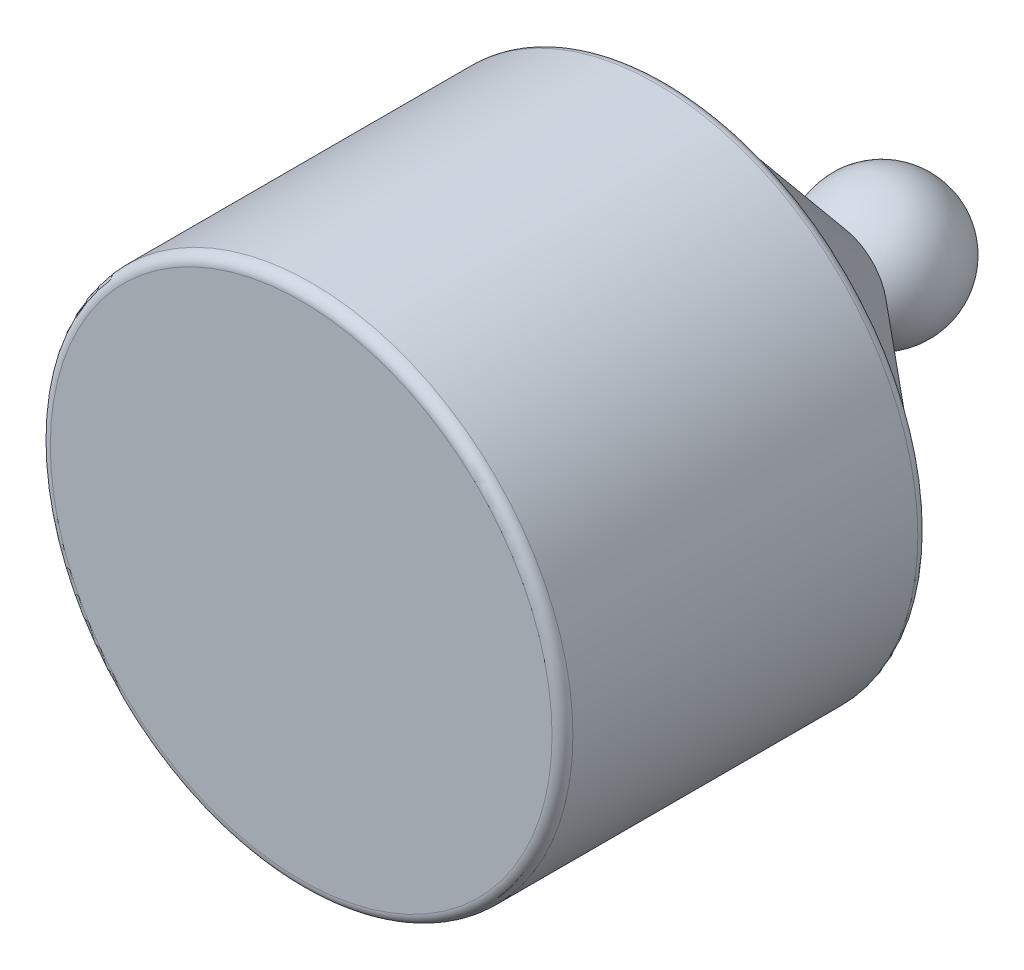
ISO-10303-21;
HEADER;
FILE_DESCRIPTION(('STEP AP214'),'2;1');
FILE_NAME('part.step','',(''),(''),'','','');
FILE_SCHEMA(('AUTOMOTIVE_DESIGN { 1 0 10303 214 1 1 1 1 }'));
ENDSEC;
DATA;
#1=APPLICATION_CONTEXT('core data for automotive mechanical design processes');
#2=APPLICATION_PROTOCOL_DEFINITION('international standard','automotive_design',2000,#1);
#3=PRODUCT_CONTEXT('',#1,'mechanical');
#4=PRODUCT('Part','Part','',(#3));
#5=PRODUCT_RELATED_PRODUCT_CATEGORY('part','',(#4));
#6=PRODUCT_DEFINITION_FORMATION('','',#4);
#7=PRODUCT_DEFINITION_CONTEXT('part definition',#1,'design');
#8=PRODUCT_DEFINITION('design','',#6,#7);
#9=PRODUCT_DEFINITION_SHAPE('','',#8);
#10=(LENGTH_UNIT() NAMED_UNIT(*) SI_UNIT(.MILLI.,.METRE.));
#11=(NAMED_UNIT(*) PLANE_ANGLE_UNIT() SI_UNIT($,.RADIAN.));
#12=(NAMED_UNIT(*) SI_UNIT($,.STERADIAN.) SOLID_ANGLE_UNIT());
#13=UNCERTAINTY_MEASURE_WITH_UNIT(LENGTH_MEASURE(1.E-05),#10,'distance_accuracy_value','');
#14=(GEOMETRIC_REPRESENTATION_CONTEXT(3) GLOBAL_UNCERTAINTY_ASSIGNED_CONTEXT((#13)) GLOBAL_UNIT_ASSIGNED_CONTEXT((#10,
#11,#12)) REPRESENTATION_CONTEXT('',''));
#15=CARTESIAN_POINT('',(0.,0.,0.));
#16=DIRECTION('',(0.,0.,1.));
#17=DIRECTION('',(1.,0.,0.));
#18=AXIS2_PLACEMENT_3D('',#15,#16,#17);
#19=CARTESIAN_POINT('',(0.,0.,7.));
#20=DIRECTION('',(0.,0.,-1.));
#21=DIRECTION('',(-1.,0.,0.));
#22=AXIS2_PLACEMENT_3D('',#19,#20,#21);
#23=CYLINDRICAL_SURFACE('',#22,5.);
#24=CARTESIAN_POINT('',(0.,0.,0.2));
#25=DIRECTION('',(0.,0.,1.));
#26=DIRECTION('',(1.,0.,0.));
#27=AXIS2_PLACEMENT_3D('',#24,#25,#26);
#28=CIRCLE('',#27,5.);
#29=CARTESIAN_POINT('',(-5.,0.,0.2));
#30=VERTEX_POINT('',#29);
#31=EDGE_CURVE('E44',#30,#30,#28,.T.);
#32=CARTESIAN_POINT('',(0.,0.,6.8));
#33=DIRECTION('',(0.,0.,1.));
#34=DIRECTION('',(1.,0.,0.));
#35=AXIS2_PLACEMENT_3D('',#32,#33,#34);
#36=CIRCLE('',#35,5.);
#37=CARTESIAN_POINT('',(-5.,0.,6.8));
#38=VERTEX_POINT('',#37);
#39=EDGE_CURVE('E59',#38,#38,#36,.F.);
#40=CARTESIAN_POINT('',(-5.,0.,0.2));
#41=CARTESIAN_POINT('',(-5.,0.,0.26875));
#42=CARTESIAN_POINT('',(-5.,0.,0.3375));
#43=CARTESIAN_POINT('',(-5.,0.,0.474999999999999));
#44=CARTESIAN_POINT('',(-5.,0.,0.543749999999999));
#45=CARTESIAN_POINT('',(-5.,0.,0.681249999999999));
#46=CARTESIAN_POINT('',(-5.,0.,0.749999999999999));
#47=CARTESIAN_POINT('',(-5.,0.,0.887499999999999));
#48=CARTESIAN_POINT('',(-5.,0.,0.95625));
#49=CARTESIAN_POINT('',(-5.,0.,1.09375));
#50=CARTESIAN_POINT('',(-5.,0.,1.1625));
#51=CARTESIAN_POINT('',(-5.,0.,1.3));
#52=CARTESIAN_POINT('',(-5.,0.,1.36875));
#53=CARTESIAN_POINT('',(-5.,0.,1.50625));
#54=CARTESIAN_POINT('',(-5.,0.,1.575));
#55=CARTESIAN_POINT('',(-5.,0.,1.7125));
#56=CARTESIAN_POINT('',(-5.,0.,1.78125));
#57=CARTESIAN_POINT('',(-5.,0.,1.91875));
#58=CARTESIAN_POINT('',(-5.,0.,1.9875));
#59=CARTESIAN_POINT('',(-5.,0.,2.125));
#60=CARTESIAN_POINT('',(-5.,0.,2.19375));
#61=CARTESIAN_POINT('',(-5.,0.,2.33125));
#62=CARTESIAN_POINT('',(-5.,0.,2.4));
#63=CARTESIAN_POINT('',(-5.,0.,2.5375));
#64=CARTESIAN_POINT('',(-5.,0.,2.60625));
#65=CARTESIAN_POINT('',(-5.,0.,2.74375));
#66=CARTESIAN_POINT('',(-5.,0.,2.8125));
#67=CARTESIAN_POINT('',(-5.,0.,2.95));
#68=CARTESIAN_POINT('',(-5.,0.,3.01875));
#69=CARTESIAN_POINT('',(-5.,0.,3.15625));
#70=CARTESIAN_POINT('',(-5.,0.,3.225));
#71=CARTESIAN_POINT('',(-5.,0.,3.3625));
#72=CARTESIAN_POINT('',(-5.,0.,3.43125));
#73=CARTESIAN_POINT('',(-5.,0.,3.56875));
#74=CARTESIAN_POINT('',(-5.,0.,3.6375));
#75=CARTESIAN_POINT('',(-5.,0.,3.775));
#76=CARTESIAN_POINT('',(-5.,0.,3.84375));
#77=CARTESIAN_POINT('',(-5.,0.,3.98125));
#78=CARTESIAN_POINT('',(-5.,0.,4.05));
#79=CARTESIAN_POINT('',(-5.,0.,4.1875));
#80=CARTESIAN_POINT('',(-5.,0.,4.25625));
#81=CARTESIAN_POINT('',(-5.,0.,4.39375));
#82=CARTESIAN_POINT('',(-5.,0.,4.4625));
#83=CARTESIAN_POINT('',(-5.,0.,4.6));
#84=CARTESIAN_POINT('',(-5.,0.,4.66875));
#85=CARTESIAN_POINT('',(-5.,0.,4.80625));
#86=CARTESIAN_POINT('',(-5.,0.,4.875));
#87=CARTESIAN_POINT('',(-5.,0.,5.0125));
#88=CARTESIAN_POINT('',(-5.,0.,5.08125));
#89=CARTESIAN_POINT('',(-5.,0.,5.21875));
#90=CARTESIAN_POINT('',(-5.,0.,5.2875));
#91=CARTESIAN_POINT('',(-5.,0.,5.425));
#92=CARTESIAN_POINT('',(-5.,0.,5.49375));
#93=CARTESIAN_POINT('',(-5.,0.,5.63125));
#94=CARTESIAN_POINT('',(-5.,0.,5.7));
#95=CARTESIAN_POINT('',(-5.,0.,5.8375));
#96=CARTESIAN_POINT('',(-5.,0.,5.90625));
#97=CARTESIAN_POINT('',(-5.,0.,6.04375));
#98=CARTESIAN_POINT('',(-5.,0.,6.1125));
#99=CARTESIAN_POINT('',(-5.,0.,6.25));
#100=CARTESIAN_POINT('',(-5.,0.,6.31875));
#101=CARTESIAN_POINT('',(-5.,0.,6.45625));
#102=CARTESIAN_POINT('',(-5.,0.,6.525));
#103=CARTESIAN_POINT('',(-5.,0.,6.6625));
#104=CARTESIAN_POINT('',(-5.,0.,6.73125));
#105=CARTESIAN_POINT('',(-5.,0.,6.8));
#106=B_SPLINE_CURVE_WITH_KNOTS('',3,(#40,#41,#42,#43,#44,#45,#46,#47,#48,#49,#50,#51,#52,#53,
#54,#55,#56,#57,#58,#59,#60,#61,#62,#63,#64,#65,#66,#67,#68,#69,#70,#71,#72,#73,#74,#75,#76,#77,
#78,#79,#80,#81,#82,#83,#84,#85,#86,#87,#88,#89,#90,#91,#92,#93,#94,#95,#96,#97,#98,#99,#100,
#101,#102,#103,#104,#105),.UNSPECIFIED.,.F.,.F.,(4,2,2,2,2,2,2,2,2,2,2,2,2,2,2,2,2,2,2,2,2,2,2,
2,2,2,2,2,2,2,2,2,4),(0.,0.20625,0.4125,0.618749999999999,0.825,1.03125,1.2375,1.44375,1.65,
1.85625,2.0625,2.26875,2.475,2.68125,2.8875,3.09375,3.3,3.50625,3.7125,3.91875,4.125,4.33125,
4.5375,4.74375,4.95,5.15625,5.3625,5.56875,5.775,5.98125,6.1875,6.39375,6.6),.UNSPECIFIED.);
#107=EDGE_CURVE('BSEAM37',#30,#38,#106,.T.);
#108=ORIENTED_EDGE('',*,*,#31,.T.);
#109=ORIENTED_EDGE('',*,*,#39,.T.);
#110=ORIENTED_EDGE('',*,*,#107,.T.);
#111=ORIENTED_EDGE('',*,*,#107,.F.);
#112=EDGE_LOOP('',(#108,#110,#109,#111));
#113=FACE_BOUND('',#112,.T.);
#114=ADVANCED_FACE('F37',(#113),#23,.T.);
#115=CARTESIAN_POINT('',(0.,0.,7.));
#116=DIRECTION('',(0.,0.,1.));
#117=DIRECTION('',(1.,0.,0.));
#118=AXIS2_PLACEMENT_3D('',#115,#116,#117);
#119=PLANE('',#118);
#120=CARTESIAN_POINT('',(0.,0.,7.));
#121=DIRECTION('',(0.,0.,1.));
#122=DIRECTION('',(1.,0.,0.));
#123=AXIS2_PLACEMENT_3D('',#120,#121,#122);
#124=CIRCLE('',#123,4.8);
#125=CARTESIAN_POINT('',(4.8,0.,7.));
#126=VERTEX_POINT('',#125);
#127=EDGE_CURVE('E56',#126,#126,#124,.T.);
#128=ORIENTED_EDGE('',*,*,#127,.T.);
#129=EDGE_LOOP('',(#128));
#130=FACE_BOUND('',#129,.T.);
#131=ADVANCED_FACE('F74',(#130),#119,.T.);
#132=CARTESIAN_POINT('',(0.,0.,6.8));
#133=DIRECTION('',(0.,0.,1.));
#134=DIRECTION('',(1.,0.,0.));
#135=AXIS2_PLACEMENT_3D('',#132,#133,#134);
#136=TOROIDAL_SURFACE('',#135,4.8,0.2);
#137=ORIENTED_EDGE('',*,*,#39,.F.);
#138=EDGE_LOOP('',(#137));
#139=FACE_BOUND('',#138,.T.);
#140=ORIENTED_EDGE('',*,*,#127,.F.);
#141=EDGE_LOOP('',(#140));
#142=FACE_BOUND('',#141,.T.);
#143=ADVANCED_FACE('F69',(#139,#142),#136,.T.);
#144=CARTESIAN_POINT('',(0.,0.,0.2));
#145=DIRECTION('',(0.,0.,1.));
#146=DIRECTION('',(1.,0.,0.));
#147=AXIS2_PLACEMENT_3D('',#144,#145,#146);
#148=TOROIDAL_SURFACE('',#147,4.8,0.2);
#149=CARTESIAN_POINT('',(0.,0.,0.));
#150=DIRECTION('',(0.,0.,1.));
#151=DIRECTION('',(1.,0.,0.));
#152=AXIS2_PLACEMENT_3D('',#149,#150,#151);
#153=CIRCLE('',#152,4.8);
#154=CARTESIAN_POINT('',(4.8,0.,0.));
#155=VERTEX_POINT('',#154);
#156=EDGE_CURVE('E11',#155,#155,#153,.F.);
#157=ORIENTED_EDGE('',*,*,#156,.F.);
#158=EDGE_LOOP('',(#157));
#159=FACE_BOUND('',#158,.T.);
#160=ORIENTED_EDGE('',*,*,#31,.F.);
#161=EDGE_LOOP('',(#160));
#162=FACE_BOUND('',#161,.T.);
#163=ADVANCED_FACE('F39',(#159,#162),#148,.T.);
#164=CARTESIAN_POINT('',(0.0178548398402125,0.,-4.09989551556878));
#165=DIRECTION('',(0.,-1.,0.));
#166=DIRECTION('',(-1.,0.,0.));
#167=AXIS2_PLACEMENT_3D('',#164,#165,#166);
#168=CIRCLE('',#167,1.32219384404725);
#169=TRIMMED_CURVE('',#168,(PARAMETER_VALUE(-1.55729196612696)),
(PARAMETER_VALUE(1.55729196612696)),.T.,.PARAMETER.);
#170=CARTESIAN_POINT('',(0.,0.,-4.09989551556878));
#171=DIRECTION('',(0.,0.,-1.));
#172=AXIS1_PLACEMENT('',#170,#171);
#173=SURFACE_OF_REVOLUTION('',#169,#172);
#174=CARTESIAN_POINT('',(0.,0.,-5.42196879868539));
#175=VERTEX_POINT('',#174);
#176=VERTEX_LOOP('',#175);
#177=FACE_BOUND('',#176,.T.);
#178=CARTESIAN_POINT('',(0.,0.,-3.23036151080531));
#179=DIRECTION('',(0.,0.,-1.));
#180=DIRECTION('',(-1.,0.,0.));
#181=AXIS2_PLACEMENT_3D('',#178,#179,#180);
#182=CIRCLE('',#181,0.978190930090288);
#183=CARTESIAN_POINT('',(0.978190930090289,0.,-3.23036151080531));
#184=VERTEX_POINT('',#183);
#185=EDGE_CURVE('E54',#184,#184,#182,.T.);
#186=ORIENTED_EDGE('',*,*,#185,.T.);
#187=EDGE_LOOP('',(#186));
#188=FACE_BOUND('',#187,.T.);
#189=ADVANCED_FACE('F47',(#177,#188),#173,.T.);
#190=CARTESIAN_POINT('',(0.,0.,0.));
#191=DIRECTION('',(0.,0.,1.));
#192=DIRECTION('',(1.,0.,0.));
#193=AXIS2_PLACEMENT_3D('',#190,#191,#192);
#194=CONICAL_SURFACE('',#193,4.8,0.869069804265285);
#195=CARTESIAN_POINT('',(0.978190930090289,0.,-3.23036151080531));
#196=CARTESIAN_POINT('',(1.01800144123518,0.,-3.19671191173442));
#197=CARTESIAN_POINT('',(1.05781195238007,0.,-3.16306231266353));
#198=CARTESIAN_POINT('',(1.13743297466986,0.,-3.09576311452175));
#199=CARTESIAN_POINT('',(1.17724348581475,0.,-3.06211351545086));
#200=CARTESIAN_POINT('',(1.25686450810454,0.,-2.99481431730909));
#201=CARTESIAN_POINT('',(1.29667501924943,0.,-2.9611647182382));
#202=CARTESIAN_POINT('',(1.37629604153922,0.,-2.89386552009642));
#203=CARTESIAN_POINT('',(1.41610655268411,0.,-2.86021592102553));
#204=CARTESIAN_POINT('',(1.49572757497389,0.,-2.79291672288375));
#205=CARTESIAN_POINT('',(1.53553808611879,0.,-2.75926712381287));
#206=CARTESIAN_POINT('',(1.61515910840857,0.,-2.69196792567109));
#207=CARTESIAN_POINT('',(1.65496961955347,0.,-2.6583183266002));
#208=CARTESIAN_POINT('',(1.73459064184325,0.,-2.59101912845842));
#209=CARTESIAN_POINT('',(1.77440115298814,0.,-2.55736952938753));
#210=CARTESIAN_POINT('',(1.85402217527793,0.,-2.49007033124576));
#211=CARTESIAN_POINT('',(1.89383268642282,0.,-2.45642073217487));
#212=CARTESIAN_POINT('',(1.97345370871261,0.,-2.38912153403309));
#213=CARTESIAN_POINT('',(2.0132642198575,0.,-2.3554719349622));
#214=CARTESIAN_POINT('',(2.09288524214729,0.,-2.28817273682042));
#215=CARTESIAN_POINT('',(2.13269575329218,0.,-2.25452313774954));
#216=CARTESIAN_POINT('',(2.21231677558197,0.,-2.18722393960776));
#217=CARTESIAN_POINT('',(2.25212728672686,0.,-2.15357434053687));
#218=CARTESIAN_POINT('',(2.33174830901664,0.,-2.08627514239509));
#219=CARTESIAN_POINT('',(2.37155882016154,0.,-2.0526255433242));
#220=CARTESIAN_POINT('',(2.45117984245132,0.,-1.98532634518243));
#221=CARTESIAN_POINT('',(2.49099035359622,0.,-1.95167674611154));
#222=CARTESIAN_POINT('',(2.570611375886,0.,-1.88437754796976));
#223=CARTESIAN_POINT('',(2.61042188703089,0.,-1.85072794889887));
#224=CARTESIAN_POINT('',(2.69004290932068,0.,-1.7834287507571));
#225=CARTESIAN_POINT('',(2.72985342046557,0.,-1.74977915168621));
#226=CARTESIAN_POINT('',(2.80947444275536,0.,-1.68247995354443));
#227=CARTESIAN_POINT('',(2.84928495390025,0.,-1.64883035447354));
#228=CARTESIAN_POINT('',(2.92890597619004,0.,-1.58153115633176));
#229=CARTESIAN_POINT('',(2.96871648733493,0.,-1.54788155726088));
#230=CARTESIAN_POINT('',(3.04833750962471,0.,-1.4805823591191));
#231=CARTESIAN_POINT('',(3.08814802076961,0.,-1.44693276004821));
#232=CARTESIAN_POINT('',(3.16776904305939,0.,-1.37963356190643));
#233=CARTESIAN_POINT('',(3.20757955420429,0.,-1.34598396283554));
#234=CARTESIAN_POINT('',(3.28720057649407,0.,-1.27868476469377));
#235=CARTESIAN_POINT('',(3.32701108763896,0.,-1.24503516562288));
#236=CARTESIAN_POINT('',(3.40663210992875,0.,-1.1777359674811));
#237=CARTESIAN_POINT('',(3.44644262107364,0.,-1.14408636841021));
#238=CARTESIAN_POINT('',(3.52606364336343,0.,-1.07678717026844));
#239=CARTESIAN_POINT('',(3.56587415450832,0.,-1.04313757119755));
#240=CARTESIAN_POINT('',(3.64549517679811,0.,-0.975838373055769));
#241=CARTESIAN_POINT('',(3.685305687943,0.,-0.942188773984881));
#242=CARTESIAN_POINT('',(3.76492671023279,0.,-0.874889575843103));
#243=CARTESIAN_POINT('',(3.80473722137768,0.,-0.841239976772215));
#244=CARTESIAN_POINT('',(3.88435824366746,0.,-0.773940778630438));
#245=CARTESIAN_POINT('',(3.92416875481236,0.,-0.740291179559549));
#246=CARTESIAN_POINT('',(4.00378977710214,0.,-0.672991981417772));
#247=CARTESIAN_POINT('',(4.04360028824704,0.,-0.639342382346884));
#248=CARTESIAN_POINT('',(4.12322131053682,0.,-0.572043184205106));
#249=CARTESIAN_POINT('',(4.16303182168171,0.,-0.538393585134218));
#250=CARTESIAN_POINT('',(4.2426528439715,0.,-0.47109438699244));
#251=CARTESIAN_POINT('',(4.28246335511639,0.,-0.437444787921552));
#252=CARTESIAN_POINT('',(4.36208437740618,0.,-0.370145589779775));
#253=CARTESIAN_POINT('',(4.40189488855107,0.,-0.336495990708886));
#254=CARTESIAN_POINT('',(4.48151591084086,0.,-0.269196792567109));
#255=CARTESIAN_POINT('',(4.52132642198575,0.,-0.23554719349622));
#256=CARTESIAN_POINT('',(4.60094744427554,0.,-0.168247995354443));
#257=CARTESIAN_POINT('',(4.64075795542043,0.,-0.134598396283554));
#258=CARTESIAN_POINT('',(4.72037897771021,0.,-0.0672991981417772));
#259=CARTESIAN_POINT('',(4.76018948885511,0.,-0.0336495990708887));
#260=CARTESIAN_POINT('',(4.8,0.,0.));
#261=B_SPLINE_CURVE_WITH_KNOTS('',3,(#195,#196,#197,#198,#199,#200,#201,#202,#203,#204,#205,
#206,#207,#208,#209,#210,#211,#212,#213,#214,#215,#216,#217,#218,#219,#220,#221,#222,#223,#224,
#225,#226,#227,#228,#229,#230,#231,#232,#233,#234,#235,#236,#237,#238,#239,#240,#241,#242,#243,
#244,#245,#246,#247,#248,#249,#250,#251,#252,#253,#254,#255,#256,#257,#258,#259,#260),
.UNSPECIFIED.,.F.,.F.,(4,2,2,2,2,2,2,2,2,2,2,2,2,2,2,2,2,2,2,2,2,2,2,2,2,2,2,2,2,2,2,2,4),(0.,
0.156379509006911,0.312759018013822,0.469138527020734,0.625518036027645,0.781897545034556,
0.938277054041468,1.09465656304838,1.25103607205529,1.4074155810622,1.56379509006911,
1.72017459907602,1.87655410808293,2.03293361708985,2.18931312609676,2.34569263510367,
2.50207214411058,2.65845165311749,2.8148311621244,2.97121067113131,3.12759018013822,
3.28396968914514,3.44034919815205,3.59672870715896,3.75310821616587,3.90948772517278,
4.06586723417969,4.2222467431866,4.37862625219351,4.53500576120043,4.69138527020734,
4.84776477921425,5.00414428822116),.UNSPECIFIED.);
#262=EDGE_CURVE('BSEAM50',#184,#155,#261,.T.);
#263=ORIENTED_EDGE('',*,*,#185,.F.);
#264=ORIENTED_EDGE('',*,*,#156,.T.);
#265=ORIENTED_EDGE('',*,*,#262,.T.);
#266=ORIENTED_EDGE('',*,*,#262,.F.);
#267=EDGE_LOOP('',(#263,#265,#264,#266));
#268=FACE_BOUND('',#267,.T.);
#269=ADVANCED_FACE('F50',(#268),#194,.T.);
#270=CLOSED_SHELL('',(#114,#131,#143,#163,#189,#269));
#271=MANIFOLD_SOLID_BREP('B2',#270);
#272=ADVANCED_BREP_SHAPE_REPRESENTATION('',(#18,#271),#14);
#273=SHAPE_DEFINITION_REPRESENTATION(#9,#272);
ENDSEC;
END-ISO-10303-21;
